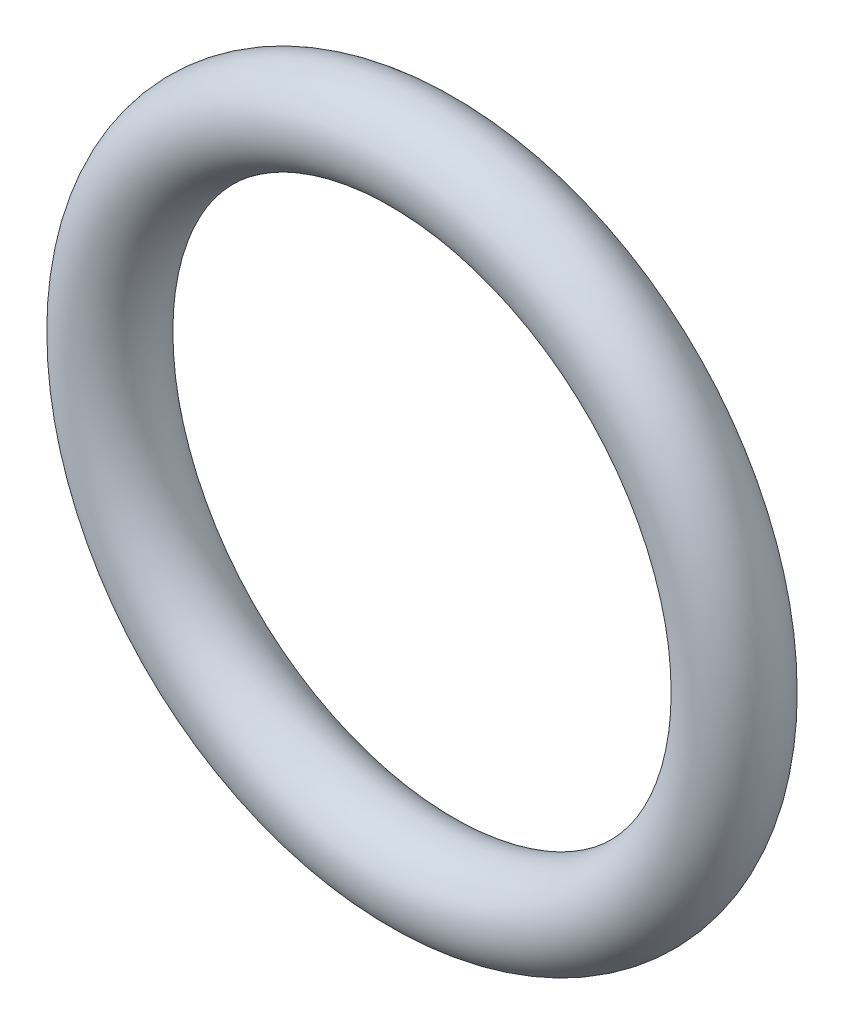
ISO-10303-21;
HEADER;
FILE_DESCRIPTION(('STEP AP214'),'2;1');
FILE_NAME('part.step','',(''),(''),'','','');
FILE_SCHEMA(('AUTOMOTIVE_DESIGN { 1 0 10303 214 1 1 1 1 }'));
ENDSEC;
DATA;
#1=APPLICATION_CONTEXT('core data for automotive mechanical design processes');
#2=APPLICATION_PROTOCOL_DEFINITION('international standard','automotive_design',2000,#1);
#3=PRODUCT_CONTEXT('',#1,'mechanical');
#4=PRODUCT('Part','Part','',(#3));
#5=PRODUCT_RELATED_PRODUCT_CATEGORY('part','',(#4));
#6=PRODUCT_DEFINITION_FORMATION('','',#4);
#7=PRODUCT_DEFINITION_CONTEXT('part definition',#1,'design');
#8=PRODUCT_DEFINITION('design','',#6,#7);
#9=PRODUCT_DEFINITION_SHAPE('','',#8);
#10=(LENGTH_UNIT() NAMED_UNIT(*) SI_UNIT(.MILLI.,.METRE.));
#11=(NAMED_UNIT(*) PLANE_ANGLE_UNIT() SI_UNIT($,.RADIAN.));
#12=(NAMED_UNIT(*) SI_UNIT($,.STERADIAN.) SOLID_ANGLE_UNIT());
#13=UNCERTAINTY_MEASURE_WITH_UNIT(LENGTH_MEASURE(1.E-05),#10,'distance_accuracy_value','');
#14=(GEOMETRIC_REPRESENTATION_CONTEXT(3) GLOBAL_UNCERTAINTY_ASSIGNED_CONTEXT((#13)) GLOBAL_UNIT_ASSIGNED_CONTEXT((#10,
#11,#12)) REPRESENTATION_CONTEXT('',''));
#15=CARTESIAN_POINT('',(0.,0.,0.));
#16=DIRECTION('',(0.,0.,1.));
#17=DIRECTION('',(1.,0.,0.));
#18=AXIS2_PLACEMENT_3D('',#15,#16,#17);
#19=CARTESIAN_POINT('',(0.,0.,0.));
#20=DIRECTION('',(0.,0.,-1.));
#21=DIRECTION('',(-1.,0.,0.));
#22=AXIS2_PLACEMENT_3D('',#19,#20,#21);
#23=TOROIDAL_SURFACE('',#22,3.5,0.5);
#24=CARTESIAN_POINT('',(-4.,0.,0.));
#25=VERTEX_POINT('',#24);
#26=VERTEX_LOOP('',#25);
#27=FACE_BOUND('',#26,.T.);
#28=ADVANCED_FACE('F32',(#27),#23,.T.);
#29=CLOSED_SHELL('',(#28));
#30=MANIFOLD_SOLID_BREP('B2',#29);
#31=ADVANCED_BREP_SHAPE_REPRESENTATION('',(#18,#30),#14);
#32=SHAPE_DEFINITION_REPRESENTATION(#9,#31);
ENDSEC;
END-ISO-10303-21;
